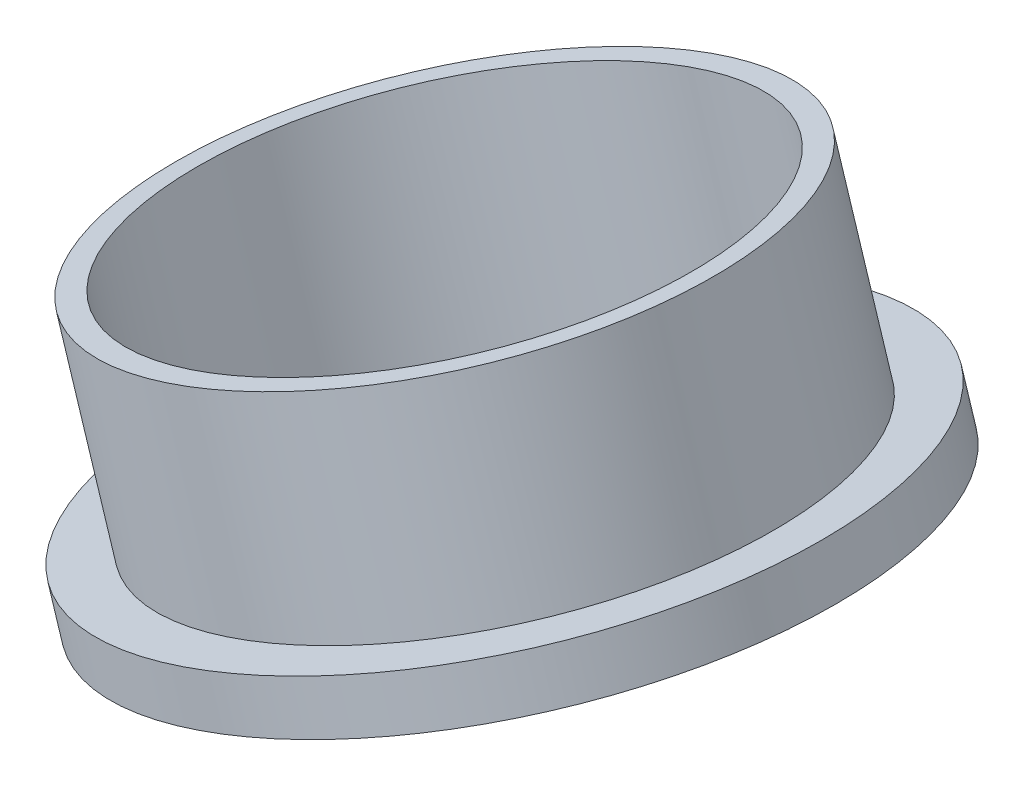
ISO-10303-21;
HEADER;
FILE_DESCRIPTION(('STEP AP214'),'2;1');
FILE_NAME('part.step','',(''),(''),'','','');
FILE_SCHEMA(('AUTOMOTIVE_DESIGN { 1 0 10303 214 1 1 1 1 }'));
ENDSEC;
DATA;
#1=APPLICATION_CONTEXT('core data for automotive mechanical design processes');
#2=APPLICATION_PROTOCOL_DEFINITION('international standard','automotive_design',2000,#1);
#3=PRODUCT_CONTEXT('',#1,'mechanical');
#4=PRODUCT('Part','Part','',(#3));
#5=PRODUCT_RELATED_PRODUCT_CATEGORY('part','',(#4));
#6=PRODUCT_DEFINITION_FORMATION('','',#4);
#7=PRODUCT_DEFINITION_CONTEXT('part definition',#1,'design');
#8=PRODUCT_DEFINITION('design','',#6,#7);
#9=PRODUCT_DEFINITION_SHAPE('','',#8);
#10=(LENGTH_UNIT() NAMED_UNIT(*) SI_UNIT(.MILLI.,.METRE.));
#11=(NAMED_UNIT(*) PLANE_ANGLE_UNIT() SI_UNIT($,.RADIAN.));
#12=(NAMED_UNIT(*) SI_UNIT($,.STERADIAN.) SOLID_ANGLE_UNIT());
#13=UNCERTAINTY_MEASURE_WITH_UNIT(LENGTH_MEASURE(1.E-05),#10,'distance_accuracy_value','');
#14=(GEOMETRIC_REPRESENTATION_CONTEXT(3) GLOBAL_UNCERTAINTY_ASSIGNED_CONTEXT((#13)) GLOBAL_UNIT_ASSIGNED_CONTEXT((#10,
#11,#12)) REPRESENTATION_CONTEXT('',''));
#15=CARTESIAN_POINT('',(0.,0.,0.));
#16=DIRECTION('',(0.,0.,1.));
#17=DIRECTION('',(1.,0.,0.));
#18=AXIS2_PLACEMENT_3D('',#15,#16,#17);
#19=CARTESIAN_POINT('',(404.28785676543,409.593144054152,0.));
#20=DIRECTION('',(-0.300714282645771,0.953714275982508,0.));
#21=DIRECTION('',(-0.953714275982508,-0.300714282645771,0.));
#22=AXIS2_PLACEMENT_3D('',#19,#20,#21);
#23=CYLINDRICAL_SURFACE('',#22,15.6);
#24=CARTESIAN_POINT('',(410.302142418345,390.518858534501,0.));
#25=DIRECTION('',(-0.300714282645771,0.953714275982508,0.));
#26=DIRECTION('',(-0.953714275982508,-0.300714282645771,0.));
#27=AXIS2_PLACEMENT_3D('',#24,#25,#26);
#28=CIRCLE('',#27,15.6);
#29=CARTESIAN_POINT('',(395.424199713018,385.827715725227,0.));
#30=VERTEX_POINT('',#29);
#31=EDGE_CURVE('E55',#30,#30,#28,.T.);
#32=ORIENTED_EDGE('',*,*,#31,.F.);
#33=EDGE_LOOP('',(#32));
#34=FACE_BOUND('',#33,.T.);
#35=CARTESIAN_POINT('',(405.791428178659,404.824572674239,0.));
#36=DIRECTION('',(-0.300714282645771,0.953714275982508,0.));
#37=DIRECTION('',(-0.953714275982508,-0.300714282645771,0.));
#38=AXIS2_PLACEMENT_3D('',#35,#36,#37);
#39=CIRCLE('',#38,15.5999999999999);
#40=CARTESIAN_POINT('',(390.913485473332,400.133429864965,0.));
#41=VERTEX_POINT('',#40);
#42=EDGE_CURVE('E10',#41,#41,#39,.T.);
#43=ORIENTED_EDGE('',*,*,#42,.T.);
#44=EDGE_LOOP('',(#43));
#45=FACE_BOUND('',#44,.T.);
#46=ADVANCED_FACE('F33',(#34,#45),#23,.F.);
#47=CARTESIAN_POINT('',(420.669370883986,409.515715483513,0.));
#48=DIRECTION('',(0.300714282645771,-0.953714275982508,0.));
#49=DIRECTION('',(0.953714275982508,0.300714282645771,0.));
#50=AXIS2_PLACEMENT_3D('',#47,#48,#49);
#51=PLANE('',#50);
#52=ORIENTED_EDGE('',*,*,#42,.F.);
#53=EDGE_LOOP('',(#52));
#54=FACE_BOUND('',#53,.T.);
#55=CARTESIAN_POINT('',(405.791428178659,404.824572674239,0.));
#56=DIRECTION('',(-0.300714282645771,0.953714275982508,0.));
#57=DIRECTION('',(-0.953714275982508,-0.300714282645771,0.));
#58=AXIS2_PLACEMENT_3D('',#55,#56,#57);
#59=CIRCLE('',#58,16.9999999999999);
#60=CARTESIAN_POINT('',(389.578285486956,399.712429869261,0.));
#61=VERTEX_POINT('',#60);
#62=EDGE_CURVE('E39',#61,#61,#59,.T.);
#63=ORIENTED_EDGE('',*,*,#62,.T.);
#64=EDGE_LOOP('',(#63));
#65=FACE_BOUND('',#64,.T.);
#66=ADVANCED_FACE('F62',(#54,#65),#51,.F.);
#67=CARTESIAN_POINT('',(404.28785676543,409.593144054152,0.));
#68=DIRECTION('',(-0.300714282645771,0.953714275982508,0.));
#69=DIRECTION('',(-0.953714275982508,-0.300714282645771,0.));
#70=AXIS2_PLACEMENT_3D('',#67,#68,#69);
#71=CYLINDRICAL_SURFACE('',#70,17.);
#72=ORIENTED_EDGE('',*,*,#62,.F.);
#73=EDGE_LOOP('',(#72));
#74=FACE_BOUND('',#73,.T.);
#75=CARTESIAN_POINT('',(409.399999570408,393.380001362449,0.));
#76=DIRECTION('',(-0.300714282645771,0.953714275982508,0.));
#77=DIRECTION('',(-0.953714275982508,-0.300714282645771,0.));
#78=AXIS2_PLACEMENT_3D('',#75,#76,#77);
#79=CIRCLE('',#78,17.);
#80=CARTESIAN_POINT('',(393.186856878705,388.267858557471,0.));
#81=VERTEX_POINT('',#80);
#82=EDGE_CURVE('E43',#81,#81,#79,.T.);
#83=ORIENTED_EDGE('',*,*,#82,.T.);
#84=EDGE_LOOP('',(#83));
#85=FACE_BOUND('',#84,.T.);
#86=ADVANCED_FACE('F66',(#74,#85),#71,.T.);
#87=CARTESIAN_POINT('',(425.613142262111,398.492144167427,0.));
#88=DIRECTION('',(0.300714282645771,-0.953714275982508,0.));
#89=DIRECTION('',(0.953714275982508,0.300714282645771,0.));
#90=AXIS2_PLACEMENT_3D('',#87,#88,#89);
#91=PLANE('',#90);
#92=ORIENTED_EDGE('',*,*,#82,.F.);
#93=EDGE_LOOP('',(#92));
#94=FACE_BOUND('',#93,.T.);
#95=CARTESIAN_POINT('',(409.399999570408,393.380001362449,0.));
#96=DIRECTION('',(-0.300714282645771,0.953714275982508,0.));
#97=DIRECTION('',(-0.953714275982508,-0.300714282645771,0.));
#98=AXIS2_PLACEMENT_3D('',#95,#96,#97);
#99=CIRCLE('',#98,20.0000000000001);
#100=CARTESIAN_POINT('',(390.325714050758,387.365715709534,0.));
#101=VERTEX_POINT('',#100);
#102=EDGE_CURVE('E47',#101,#101,#99,.T.);
#103=ORIENTED_EDGE('',*,*,#102,.T.);
#104=EDGE_LOOP('',(#103));
#105=FACE_BOUND('',#104,.T.);
#106=ADVANCED_FACE('F71',(#94,#105),#91,.F.);
#107=CARTESIAN_POINT('',(404.28785676543,409.593144054152,0.));
#108=DIRECTION('',(-0.300714282645771,0.953714275982508,0.));
#109=DIRECTION('',(-0.953714275982508,-0.300714282645771,0.));
#110=AXIS2_PLACEMENT_3D('',#107,#108,#109);
#111=CYLINDRICAL_SURFACE('',#110,20.0000000000001);
#112=ORIENTED_EDGE('',*,*,#102,.F.);
#113=EDGE_LOOP('',(#112));
#114=FACE_BOUND('',#113,.T.);
#115=CARTESIAN_POINT('',(410.302142418345,390.518858534501,0.));
#116=DIRECTION('',(-0.300714282645771,0.953714275982508,0.));
#117=DIRECTION('',(-0.953714275982508,-0.300714282645771,0.));
#118=AXIS2_PLACEMENT_3D('',#115,#116,#117);
#119=CIRCLE('',#118,20.);
#120=CARTESIAN_POINT('',(391.227856898695,384.504572881586,0.));
#121=VERTEX_POINT('',#120);
#122=EDGE_CURVE('E52',#121,#121,#119,.T.);
#123=ORIENTED_EDGE('',*,*,#122,.T.);
#124=EDGE_LOOP('',(#123));
#125=FACE_BOUND('',#124,.T.);
#126=ADVANCED_FACE('F77',(#114,#125),#111,.T.);
#127=CARTESIAN_POINT('',(429.376427937996,396.533144187417,0.));
#128=DIRECTION('',(-0.300714282645771,0.953714275982508,0.));
#129=DIRECTION('',(-0.953714275982508,-0.300714282645771,0.));
#130=AXIS2_PLACEMENT_3D('',#127,#128,#129);
#131=PLANE('',#130);
#132=ORIENTED_EDGE('',*,*,#122,.F.);
#133=EDGE_LOOP('',(#132));
#134=FACE_BOUND('',#133,.T.);
#135=ORIENTED_EDGE('',*,*,#31,.T.);
#136=EDGE_LOOP('',(#135));
#137=FACE_BOUND('',#136,.T.);
#138=ADVANCED_FACE('F59',(#134,#137),#131,.F.);
#139=CLOSED_SHELL('',(#46,#66,#86,#106,#126,#138));
#140=MANIFOLD_SOLID_BREP('B2',#139);
#141=ADVANCED_BREP_SHAPE_REPRESENTATION('',(#18,#140),#14);
#142=SHAPE_DEFINITION_REPRESENTATION(#9,#141);
ENDSEC;
END-ISO-10303-21;
